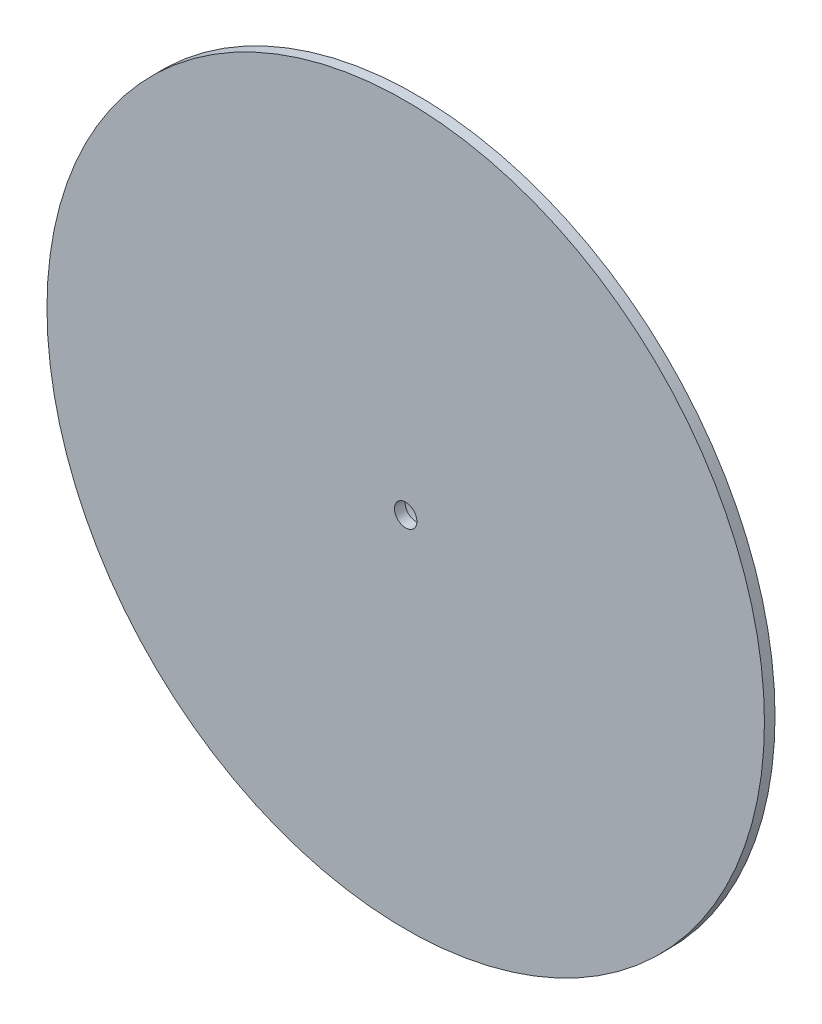
ISO-10303-21;
HEADER;
FILE_DESCRIPTION(('STEP AP214'),'2;1');
FILE_NAME('part.step','',(''),(''),'','','');
FILE_SCHEMA(('AUTOMOTIVE_DESIGN { 1 0 10303 214 1 1 1 1 }'));
ENDSEC;
DATA;
#1=APPLICATION_CONTEXT('core data for automotive mechanical design processes');
#2=APPLICATION_PROTOCOL_DEFINITION('international standard','automotive_design',2000,#1);
#3=PRODUCT_CONTEXT('',#1,'mechanical');
#4=PRODUCT('Part','Part','',(#3));
#5=PRODUCT_RELATED_PRODUCT_CATEGORY('part','',(#4));
#6=PRODUCT_DEFINITION_FORMATION('','',#4);
#7=PRODUCT_DEFINITION_CONTEXT('part definition',#1,'design');
#8=PRODUCT_DEFINITION('design','',#6,#7);
#9=PRODUCT_DEFINITION_SHAPE('','',#8);
#10=(LENGTH_UNIT() NAMED_UNIT(*) SI_UNIT(.MILLI.,.METRE.));
#11=(NAMED_UNIT(*) PLANE_ANGLE_UNIT() SI_UNIT($,.RADIAN.));
#12=(NAMED_UNIT(*) SI_UNIT($,.STERADIAN.) SOLID_ANGLE_UNIT());
#13=UNCERTAINTY_MEASURE_WITH_UNIT(LENGTH_MEASURE(1.E-05),#10,'distance_accuracy_value','');
#14=(GEOMETRIC_REPRESENTATION_CONTEXT(3) GLOBAL_UNCERTAINTY_ASSIGNED_CONTEXT((#13)) GLOBAL_UNIT_ASSIGNED_CONTEXT((#10,
#11,#12)) REPRESENTATION_CONTEXT('',''));
#15=CARTESIAN_POINT('',(0.,0.,0.));
#16=DIRECTION('',(0.,0.,1.));
#17=DIRECTION('',(1.,0.,0.));
#18=AXIS2_PLACEMENT_3D('',#15,#16,#17);
#19=CARTESIAN_POINT('',(0.,0.,0.));
#20=DIRECTION('',(0.,0.,1.));
#21=DIRECTION('',(1.,0.,0.));
#22=AXIS2_PLACEMENT_3D('',#19,#20,#21);
#23=PLANE('',#22);
#24=CARTESIAN_POINT('',(0.,0.,0.));
#25=DIRECTION('',(0.,0.,1.));
#26=DIRECTION('',(1.,0.,0.));
#27=AXIS2_PLACEMENT_3D('',#24,#25,#26);
#28=CIRCLE('',#27,9.525);
#29=CARTESIAN_POINT('',(9.525,0.,0.));
#30=VERTEX_POINT('',#29);
#31=EDGE_CURVE('E48',#30,#30,#28,.T.);
#32=ORIENTED_EDGE('',*,*,#31,.F.);
#33=EDGE_LOOP('',(#32));
#34=FACE_BOUND('',#33,.T.);
#35=CARTESIAN_POINT('',(0.,0.,0.));
#36=DIRECTION('',(0.,0.,1.));
#37=DIRECTION('',(1.,0.,0.));
#38=AXIS2_PLACEMENT_3D('',#35,#36,#37);
#39=CIRCLE('',#38,2.599995);
#40=CARTESIAN_POINT('',(2.599995,0.,0.));
#41=VERTEX_POINT('',#40);
#42=EDGE_CURVE('E55',#41,#41,#39,.T.);
#43=ORIENTED_EDGE('',*,*,#42,.T.);
#44=EDGE_LOOP('',(#43));
#45=FACE_BOUND('',#44,.T.);
#46=ADVANCED_FACE('F44',(#34,#45),#23,.F.);
#47=CARTESIAN_POINT('',(0.,0.,5.));
#48=DIRECTION('',(0.,0.,-1.));
#49=DIRECTION('',(-1.,0.,0.));
#50=AXIS2_PLACEMENT_3D('',#47,#48,#49);
#51=CYLINDRICAL_SURFACE('',#50,9.525);
#52=CARTESIAN_POINT('',(0.,9.525,3.9));
#53=CARTESIAN_POINT('',(0.0781866987109185,9.52499876460585,3.89999676177362));
#54=CARTESIAN_POINT('',(0.156419221102357,9.52402719829567,3.89342807738343));
#55=CARTESIAN_POINT('',(0.310698821870453,9.52024492655388,3.86733282346226));
#56=CARTESIAN_POINT('',(0.386743675519527,9.51743241352691,3.84779351802418));
#57=CARTESIAN_POINT('',(0.5343927745838,9.51028441327874,3.79635240201702));
#58=CARTESIAN_POINT('',(0.606000282843496,9.50595006110438,3.76445980319044));
#59=CARTESIAN_POINT('',(0.742835911522383,9.49623773185762,3.68923963245356));
#60=CARTESIAN_POINT('',(0.808064942988792,9.49085990415479,3.64591369686282));
#61=CARTESIAN_POINT('',(0.930793353147971,9.47961378730952,3.54870975497454));
#62=CARTESIAN_POINT('',(0.988237870136282,9.47374244644208,3.49476282680308));
#63=CARTESIAN_POINT('',(1.09329338010702,9.46219501807809,3.37799654223162));
#64=CARTESIAN_POINT('',(1.1409038163322,9.4565189416516,3.31517668382882));
#65=CARTESIAN_POINT('',(1.22515211249958,9.44597505901761,3.18208063312827));
#66=CARTESIAN_POINT('',(1.26173709992712,9.44111119590441,3.11177063367982));
#67=CARTESIAN_POINT('',(1.32255813135312,9.43278395494999,2.96592048981992));
#68=CARTESIAN_POINT('',(1.34679482137331,9.42932050384585,2.8903806192528));
#69=CARTESIAN_POINT('',(1.38206133446873,9.42421614183361,2.73679113159458));
#70=CARTESIAN_POINT('',(1.39318493095542,9.42256229639832,2.6587634839914));
#71=CARTESIAN_POINT('',(1.40219995736058,9.4212250973639,2.50193289507959));
#72=CARTESIAN_POINT('',(1.4000921171939,9.42154163506819,2.42312999677727));
#73=CARTESIAN_POINT('',(1.38278078144997,9.42409760788303,2.26764709109889));
#74=CARTESIAN_POINT('',(1.36768157603395,9.42632172912797,2.19095518420142));
#75=CARTESIAN_POINT('',(1.32497930663464,9.43241835022669,2.04120539835853));
#76=CARTESIAN_POINT('',(1.29737590185164,9.4362908950078,1.96814761852081));
#77=CARTESIAN_POINT('',(1.23033985517003,9.44526500020631,1.82742175227237));
#78=CARTESIAN_POINT('',(1.19086289034364,9.45037115126149,1.75977508422353));
#79=CARTESIAN_POINT('',(1.10123191313812,9.46123378897109,1.63202672775549));
#80=CARTESIAN_POINT('',(1.05107722752643,9.46699031662115,1.57192551545888));
#81=CARTESIAN_POINT('',(0.940941333333054,9.47857281026604,1.46036957660623));
#82=CARTESIAN_POINT('',(0.880870429310496,9.48439891242584,1.40900337652877));
#83=CARTESIAN_POINT('',(0.752913400811492,9.49541274097992,1.31706821729109));
#84=CARTESIAN_POINT('',(0.685027244533534,9.50060046477638,1.27649930206897));
#85=CARTESIAN_POINT('',(0.543291118251659,9.50975813243168,1.20730634912502));
#86=CARTESIAN_POINT('',(0.469437849058395,9.5137273967087,1.17868897404203));
#87=CARTESIAN_POINT('',(0.31790244986201,9.51999518336653,1.13428753260745));
#88=CARTESIAN_POINT('',(0.240220568647479,9.52229381415501,1.11850263354661));
#89=CARTESIAN_POINT('',(0.0839972754678929,9.5249470181372,1.10033154776508));
#90=CARTESIAN_POINT('',(0.0054703121669874,9.52531925382933,1.09782362381809));
#91=CARTESIAN_POINT('',(-0.150883021297296,9.5241257549903,1.10595479268006));
#92=CARTESIAN_POINT('',(-0.228709412191542,9.5225600779957,1.11659349516616));
#93=CARTESIAN_POINT('',(-0.381084890756114,9.51767760422299,1.15061470286099));
#94=CARTESIAN_POINT('',(-0.455647466798569,9.51436893682704,1.17393806250805));
#95=CARTESIAN_POINT('',(-0.599803759222323,9.50637034194778,1.23260426296617));
#96=CARTESIAN_POINT('',(-0.669397250177601,9.5016803518492,1.26794764865546));
#97=CARTESIAN_POINT('',(-0.802176271103691,9.4913965887219,1.3499373942551));
#98=CARTESIAN_POINT('',(-0.86531351301188,9.48579671649569,1.39666117574029));
#99=CARTESIAN_POINT('',(-0.98289389986906,9.4743359139053,1.49997738146307));
#100=CARTESIAN_POINT('',(-1.03733656038535,9.46847496901829,1.55657035521147));
#101=CARTESIAN_POINT('',(-1.13642388970039,9.45709677324681,1.67855971056336));
#102=CARTESIAN_POINT('',(-1.18098706775715,9.45158263153967,1.74402261789244));
#103=CARTESIAN_POINT('',(-1.25848446661376,9.44157694115363,1.8815761913987));
#104=CARTESIAN_POINT('',(-1.29141899166985,9.43708536572103,1.95366668410714));
#105=CARTESIAN_POINT('',(-1.34459715557604,9.42965571071401,2.1021834613621));
#106=CARTESIAN_POINT('',(-1.36488407478935,9.42671233862251,2.17859397248118));
#107=CARTESIAN_POINT('',(-1.39232913459725,9.4226981384178,2.33378392167989));
#108=CARTESIAN_POINT('',(-1.3994881426399,9.42162718658159,2.41256320288953));
#109=CARTESIAN_POINT('',(-1.40045413711479,9.4214835768477,2.56944241442507));
#110=CARTESIAN_POINT('',(-1.39438923716491,9.42239174512963,2.64754156860861));
#111=CARTESIAN_POINT('',(-1.36935369459666,9.42606243601036,2.80159650274563));
#112=CARTESIAN_POINT('',(-1.35038306942762,9.42882495610196,2.87755228559694));
#113=CARTESIAN_POINT('',(-1.30011922256559,9.43588648105929,3.0251312704112));
#114=CARTESIAN_POINT('',(-1.26883459825297,9.44018441373858,3.09675745504841));
#115=CARTESIAN_POINT('',(-1.19484351444486,9.44983385425447,3.23376505774757));
#116=CARTESIAN_POINT('',(-1.15213669936454,9.45518539488962,3.2991462813113));
#117=CARTESIAN_POINT('',(-1.05604672982191,9.46640084993592,3.42245949837233));
#118=CARTESIAN_POINT('',(-1.00256859691487,9.47226904074502,3.48031710054192));
#119=CARTESIAN_POINT('',(-0.886654665247106,9.48382062623112,3.58628287665215));
#120=CARTESIAN_POINT('',(-0.824216784042599,9.48950397756961,3.63438877779304));
#121=CARTESIAN_POINT('',(-0.691769263074331,9.50007965104623,3.7197111553433));
#122=CARTESIAN_POINT('',(-0.621721426060914,9.5049676431508,3.75686886201752));
#123=CARTESIAN_POINT('',(-0.476341076308347,9.51335927557351,3.81883662605286));
#124=CARTESIAN_POINT('',(-0.401014166138519,9.51686435810957,3.84365955423907));
#125=CARTESIAN_POINT('',(-0.271118598041161,9.52128927002518,3.87458102051206));
#126=CARTESIAN_POINT('',(-0.217354178642811,9.52267369549689,3.88409868504258));
#127=CARTESIAN_POINT('',(-0.109067267356373,9.52452948606479,3.89680926733448));
#128=CARTESIAN_POINT('',(-0.0545447843408702,9.5250008618385,3.90000225905892));
#129=CARTESIAN_POINT('',(0.,9.525,3.9));
#130=B_SPLINE_CURVE_WITH_KNOTS('',3,(#52,#53,#54,#55,#56,#57,#58,#59,#60,#61,#62,#63,#64,#65,
#66,#67,#68,#69,#70,#71,#72,#73,#74,#75,#76,#77,#78,#79,#80,#81,#82,#83,#84,#85,#86,#87,#88,#89,
#90,#91,#92,#93,#94,#95,#96,#97,#98,#99,#100,#101,#102,#103,#104,#105,#106,#107,#108,#109,#110,
#111,#112,#113,#114,#115,#116,#117,#118,#119,#120,#121,#122,#123,#124,#125,#126,#127,#128,#129),
.UNSPECIFIED.,.T.,.F.,(4,2,2,2,2,2,2,2,2,2,2,2,2,2,2,2,2,2,2,2,2,2,2,2,2,2,2,2,2,2,2,2,2,2,2,2,
2,2,4),(0.,0.23436079397018,0.468952048845441,0.703368706811438,0.937751833645347,
1.17370927429062,1.40968007002527,1.64676508734097,1.88383769988556,2.11920448852209,
2.35455829321684,2.58804020196426,2.82152847460209,3.0558993895711,3.29028508605434,
3.52692043769917,3.76355675228518,4.00032480926721,4.23707750096138,4.4716555878611,
4.70622671031335,4.93971334489351,5.17321056503709,5.40834296960503,5.64348847038906,
5.88050681312279,6.11751895396409,6.35371551731004,6.58989647302169,6.82379947514924,
7.05770216102613,7.29144182971485,7.52518877581289,7.76109495914289,7.99705606136531,
8.23426163982863,8.47121918170333,8.63471640910151,8.79821172449169),.UNSPECIFIED.);
#131=CARTESIAN_POINT('',(0.,9.525,3.9));
#132=VERTEX_POINT('',#131);
#133=EDGE_CURVE('E82',#132,#132,#130,.T.);
#134=ORIENTED_EDGE('',*,*,#133,.F.);
#135=EDGE_LOOP('',(#134));
#136=FACE_BOUND('',#135,.T.);
#137=CARTESIAN_POINT('',(0.,0.,5.));
#138=DIRECTION('',(0.,0.,1.));
#139=DIRECTION('',(1.,0.,0.));
#140=AXIS2_PLACEMENT_3D('',#137,#138,#139);
#141=CIRCLE('',#140,9.525);
#142=CARTESIAN_POINT('',(9.525,0.,5.));
#143=VERTEX_POINT('',#142);
#144=EDGE_CURVE('E12',#143,#143,#141,.T.);
#145=ORIENTED_EDGE('',*,*,#144,.F.);
#146=EDGE_LOOP('',(#145));
#147=FACE_BOUND('',#146,.T.);
#148=ORIENTED_EDGE('',*,*,#31,.T.);
#149=EDGE_LOOP('',(#148));
#150=FACE_BOUND('',#149,.T.);
#151=ADVANCED_FACE('F46',(#136,#147,#150),#51,.T.);
#152=CARTESIAN_POINT('',(0.,0.,5.));
#153=DIRECTION('',(0.,0.,-1.));
#154=DIRECTION('',(-1.,0.,0.));
#155=AXIS2_PLACEMENT_3D('',#152,#153,#154);
#156=CYLINDRICAL_SURFACE('',#155,2.599995);
#157=CARTESIAN_POINT('',(0.,2.599995,3.9));
#158=CARTESIAN_POINT('',(0.0729047889705803,2.59999078667712,3.89999529477338));
#159=CARTESIAN_POINT('',(0.14587527045286,2.59689696724784,3.89427217254182));
#160=CARTESIAN_POINT('',(0.289615804895891,2.58482509995093,3.87165399570647));
#161=CARTESIAN_POINT('',(0.360382408027539,2.57583826912691,3.85474226524164));
#162=CARTESIAN_POINT('',(0.497426105322078,2.55291017642826,3.81062161850003));
#163=CARTESIAN_POINT('',(0.563720196645613,2.53898909582972,3.78345461768301));
#164=CARTESIAN_POINT('',(0.690685466240474,2.50743165887607,3.71983650264355));
#165=CARTESIAN_POINT('',(0.751356551193288,2.48979524087771,3.68338523437852));
#166=CARTESIAN_POINT('',(0.869919479682686,2.45099177393897,3.59948275791417));
#167=CARTESIAN_POINT('',(0.927353515966035,2.42966742344935,3.55145860673426));
#168=CARTESIAN_POINT('',(1.03378333749361,2.38633073412561,3.44702638272309));
#169=CARTESIAN_POINT('',(1.08277158088479,2.36431780091444,3.39061089953781));
#170=CARTESIAN_POINT('',(1.17553536152474,2.31969401222259,3.26471327780319));
#171=CARTESIAN_POINT('',(1.21839633112316,2.29721942733858,3.1945027961013));
#172=CARTESIAN_POINT('',(1.29153066405412,2.25691742408613,3.04657193946939));
#173=CARTESIAN_POINT('',(1.32181383507117,2.23908638891825,2.96885747436107));
#174=CARTESIAN_POINT('',(1.3668137386416,2.21188870525528,2.81300588066102));
#175=CARTESIAN_POINT('',(1.38238827445313,2.20206099441669,2.7352014969995));
#176=CARTESIAN_POINT('',(1.40009373665063,2.19085259697842,2.57751867634597));
#177=CARTESIAN_POINT('',(1.40224231485347,2.18946081928337,2.49764310134378));
#178=CARTESIAN_POINT('',(1.39366046336704,2.19492391635172,2.35052192328691));
#179=CARTESIAN_POINT('',(1.38474227331118,2.20061871532846,2.28311578147379));
#180=CARTESIAN_POINT('',(1.35747049355557,2.21754438142815,2.15096095300736));
#181=CARTESIAN_POINT('',(1.33911296233483,2.22877756109407,2.08621338868356));
#182=CARTESIAN_POINT('',(1.29321391516784,2.25572366822494,1.9593979975604));
#183=CARTESIAN_POINT('',(1.26547735546571,2.27153060821631,1.89742170830676));
#184=CARTESIAN_POINT('',(1.20177045608236,2.30586867917457,1.77868696665894));
#185=CARTESIAN_POINT('',(1.16579649143515,2.3244010081923,1.72193082691085));
#186=CARTESIAN_POINT('',(1.08035575439139,2.36545386455347,1.6062735151577));
#187=CARTESIAN_POINT('',(1.02967388817815,2.3881553008729,1.54833084746676));
#188=CARTESIAN_POINT('',(0.919310950549458,2.43277345892092,1.44133134457699));
#189=CARTESIAN_POINT('',(0.859624231196589,2.45468967740074,1.39228012900004));
#190=CARTESIAN_POINT('',(0.728334602433867,2.49690591794703,1.30155229568497));
#191=CARTESIAN_POINT('',(0.656223244123893,2.51702236886815,1.26051872578485));
#192=CARTESIAN_POINT('',(0.504772989726001,2.55170368227059,1.19152370517262));
#193=CARTESIAN_POINT('',(0.425440730020593,2.56627357974497,1.16355039350481));
#194=CARTESIAN_POINT('',(0.26951601467922,2.58707354445778,1.12405333610286));
#195=CARTESIAN_POINT('',(0.193330101985343,2.59394135476105,1.11126538153201));
#196=CARTESIAN_POINT('',(0.039600947338834,2.60082900993271,1.09844016491548));
#197=CARTESIAN_POINT('',(-0.037941457581041,2.60085293848166,1.09839529918739));
#198=CARTESIAN_POINT('',(-0.184491835385638,2.59438215717786,1.11044491815665));
#199=CARTESIAN_POINT('',(-0.253623784879571,2.5884924331094,1.12141276921305));
#200=CARTESIAN_POINT('',(-0.388895646185386,2.5716495011182,1.15330398293682));
#201=CARTESIAN_POINT('',(-0.455035248645629,2.56069577098099,1.17422837235677));
#202=CARTESIAN_POINT('',(-0.584346642608228,2.53435908499139,1.22583158599007));
#203=CARTESIAN_POINT('',(-0.647407745033565,2.51887527211528,1.25673440327369));
#204=CARTESIAN_POINT('',(-0.767626235284159,2.48488080102223,1.32713670145014));
#205=CARTESIAN_POINT('',(-0.82478134945105,2.46636898413068,1.36663947506398));
#206=CARTESIAN_POINT('',(-0.938197899036948,2.42564886584945,1.45805343349366));
#207=CARTESIAN_POINT('',(-0.993682495454874,2.40325759590643,1.51084790729868));
#208=CARTESIAN_POINT('',(-1.09541216870017,2.35863063340585,1.62483358556953));
#209=CARTESIAN_POINT('',(-1.14164835135172,2.33639511026707,1.68603277836679));
#210=CARTESIAN_POINT('',(-1.22674045065121,2.29292893942709,1.82039321629278));
#211=CARTESIAN_POINT('',(-1.26484690031855,2.27187945881046,1.89409345548427));
#212=CARTESIAN_POINT('',(-1.32773467802452,2.23571598798997,2.04830509719545));
#213=CARTESIAN_POINT('',(-1.35253515734026,2.22059347560402,2.12880651642942));
#214=CARTESIAN_POINT('',(-1.38564605999059,2.20006963396152,2.28601628782494));
#215=CARTESIAN_POINT('',(-1.39533193719358,2.19386225284627,2.36232568138352));
#216=CARTESIAN_POINT('',(-1.40201021822551,2.1896035968583,2.51570349616486));
#217=CARTESIAN_POINT('',(-1.39901191009286,2.19154635401005,2.59277132078069));
#218=CARTESIAN_POINT('',(-1.3817364801259,2.20246553879257,2.73514235772261));
#219=CARTESIAN_POINT('',(-1.36892735972027,2.21052533723509,2.80070484672634));
#220=CARTESIAN_POINT('',(-1.33441932407695,2.23152516962156,2.92862135514861));
#221=CARTESIAN_POINT('',(-1.31271701440404,2.24446706686042,2.99097413921683));
#222=CARTESIAN_POINT('',(-1.25954151629174,2.27475686905852,3.11514691756123));
#223=CARTESIAN_POINT('',(-1.22753477284832,2.29233261204308,3.17668091801614));
#224=CARTESIAN_POINT('',(-1.15518197535647,2.32963200245548,3.29391790667453));
#225=CARTESIAN_POINT('',(-1.11483144005171,2.34935680138681,3.34961773716269));
#226=CARTESIAN_POINT('',(-1.01995378816553,2.39222927909134,3.46223077027146));
#227=CARTESIAN_POINT('',(-0.964211559727043,2.41545060073883,3.51809787640122));
#228=CARTESIAN_POINT('',(-0.8436806016577,2.46014392183939,3.62001482690573));
#229=CARTESIAN_POINT('',(-0.778885876534062,2.48161474688683,3.6660581134431));
#230=CARTESIAN_POINT('',(-0.639631828153539,2.52115520532575,3.7480280833208));
#231=CARTESIAN_POINT('',(-0.564956732052365,2.53911581974805,3.78364381366238));
#232=CARTESIAN_POINT('',(-0.409484715282539,2.56875654362687,3.84132552805587));
#233=CARTESIAN_POINT('',(-0.328704593443944,2.58045321924647,3.86342727456899));
#234=CARTESIAN_POINT('',(-0.205815447407648,2.59215891621267,3.88540417387295));
#235=CARTESIAN_POINT('',(-0.164907232978195,2.59508677825692,3.89086677492032));
#236=CARTESIAN_POINT('',(-0.0826730571552807,2.59900602030977,3.898166032335));
#237=CARTESIAN_POINT('',(-0.0413470934371935,2.59999738953651,3.90000266851393));
#238=CARTESIAN_POINT('',(0.,2.599995,3.9));
#239=B_SPLINE_CURVE_WITH_KNOTS('',3,(#157,#158,#159,#160,#161,#162,#163,#164,#165,#166,#167,
#168,#169,#170,#171,#172,#173,#174,#175,#176,#177,#178,#179,#180,#181,#182,#183,#184,#185,#186,
#187,#188,#189,#190,#191,#192,#193,#194,#195,#196,#197,#198,#199,#200,#201,#202,#203,#204,#205,
#206,#207,#208,#209,#210,#211,#212,#213,#214,#215,#216,#217,#218,#219,#220,#221,#222,#223,#224,
#225,#226,#227,#228,#229,#230,#231,#232,#233,#234,#235,#236,#237,#238),.UNSPECIFIED.,.T.,.F.,(4,
2,2,2,2,2,2,2,2,2,2,2,2,2,2,2,2,2,2,2,2,2,2,2,2,2,2,2,2,2,2,2,2,2,2,2,2,2,2,2,4),(0.,
0.2185476571075,0.437421780690726,0.655410838844262,0.873403514061681,1.10598661746122,
1.33877634716544,1.59331429358873,1.84765338676718,2.08602727311499,2.32408769064606,
2.5278243893032,2.73164623006571,2.9399979481385,3.14844153062048,3.38819707826267,
3.62810363309425,3.88283568684122,4.1373359479986,4.36870031122877,4.59992662120846,
4.80968582229974,5.01946665917302,5.23432874988971,5.44927325138268,5.68765262805976,
5.92626016287942,6.18167841769109,6.43672805614954,6.66683517643809,6.8967738291717,
7.09775416437781,7.29881128318751,7.51265311355904,7.72661009309464,7.97231141642947,
8.21817624670887,8.47076202573566,8.72267645332503,8.84662249603624,8.97056922884347),.UNSPECIFIED.);
#240=CARTESIAN_POINT('',(0.,2.599995,3.9));
#241=VERTEX_POINT('',#240);
#242=EDGE_CURVE('E74',#241,#241,#239,.T.);
#243=ORIENTED_EDGE('',*,*,#242,.T.);
#244=EDGE_LOOP('',(#243));
#245=FACE_BOUND('',#244,.T.);
#246=CARTESIAN_POINT('',(0.,0.,5.));
#247=DIRECTION('',(0.,0.,1.));
#248=DIRECTION('',(1.,0.,0.));
#249=AXIS2_PLACEMENT_3D('',#246,#247,#248);
#250=CIRCLE('',#249,2.599995);
#251=CARTESIAN_POINT('',(2.599995,0.,5.));
#252=VERTEX_POINT('',#251);
#253=EDGE_CURVE('E59',#252,#252,#250,.T.);
#254=ORIENTED_EDGE('',*,*,#253,.T.);
#255=EDGE_LOOP('',(#254));
#256=FACE_BOUND('',#255,.T.);
#257=ORIENTED_EDGE('',*,*,#42,.F.);
#258=EDGE_LOOP('',(#257));
#259=FACE_BOUND('',#258,.T.);
#260=ADVANCED_FACE('F111',(#245,#256,#259),#156,.F.);
#261=CARTESIAN_POINT('',(0.,0.,5.));
#262=DIRECTION('',(0.,0.,1.));
#263=DIRECTION('',(1.,0.,0.));
#264=AXIS2_PLACEMENT_3D('',#261,#262,#263);
#265=PLANE('',#264);
#266=CARTESIAN_POINT('',(0.,0.,5.));
#267=DIRECTION('',(0.,0.,1.));
#268=DIRECTION('',(1.,0.,0.));
#269=AXIS2_PLACEMENT_3D('',#266,#267,#268);
#270=CIRCLE('',#269,0.79375);
#271=CARTESIAN_POINT('',(0.79375,0.,5.));
#272=VERTEX_POINT('',#271);
#273=EDGE_CURVE('E66',#272,#272,#270,.T.);
#274=ORIENTED_EDGE('',*,*,#273,.T.);
#275=EDGE_LOOP('',(#274));
#276=FACE_BOUND('',#275,.T.);
#277=ORIENTED_EDGE('',*,*,#253,.F.);
#278=EDGE_LOOP('',(#277));
#279=FACE_BOUND('',#278,.T.);
#280=ADVANCED_FACE('F107',(#276,#279),#265,.F.);
#281=CARTESIAN_POINT('',(0.,0.,5.75));
#282=DIRECTION('',(0.,0.,-1.));
#283=DIRECTION('',(-1.,0.,0.));
#284=AXIS2_PLACEMENT_3D('',#281,#282,#283);
#285=CYLINDRICAL_SURFACE('',#284,25.4);
#286=CARTESIAN_POINT('',(0.,0.,5.75));
#287=DIRECTION('',(0.,0.,1.));
#288=DIRECTION('',(1.,0.,0.));
#289=AXIS2_PLACEMENT_3D('',#286,#287,#288);
#290=CIRCLE('',#289,25.4);
#291=CARTESIAN_POINT('',(25.4,0.,5.75));
#292=VERTEX_POINT('',#291);
#293=EDGE_CURVE('E62',#292,#292,#290,.T.);
#294=ORIENTED_EDGE('',*,*,#293,.F.);
#295=EDGE_LOOP('',(#294));
#296=FACE_BOUND('',#295,.T.);
#297=CARTESIAN_POINT('',(0.,0.,5.));
#298=DIRECTION('',(0.,0.,1.));
#299=DIRECTION('',(1.,0.,0.));
#300=AXIS2_PLACEMENT_3D('',#297,#298,#299);
#301=CIRCLE('',#300,25.4);
#302=CARTESIAN_POINT('',(25.4,0.,5.));
#303=VERTEX_POINT('',#302);
#304=EDGE_CURVE('E63',#303,#303,#301,.T.);
#305=ORIENTED_EDGE('',*,*,#304,.T.);
#306=EDGE_LOOP('',(#305));
#307=FACE_BOUND('',#306,.T.);
#308=ADVANCED_FACE('F103',(#296,#307),#285,.T.);
#309=CARTESIAN_POINT('',(0.,0.,5.75));
#310=DIRECTION('',(0.,0.,1.));
#311=DIRECTION('',(1.,0.,0.));
#312=AXIS2_PLACEMENT_3D('',#309,#310,#311);
#313=PLANE('',#312);
#314=CARTESIAN_POINT('',(0.,0.,5.75));
#315=DIRECTION('',(0.,0.,1.));
#316=DIRECTION('',(1.,0.,0.));
#317=AXIS2_PLACEMENT_3D('',#314,#315,#316);
#318=CIRCLE('',#317,0.79375);
#319=CARTESIAN_POINT('',(0.79375,0.,5.75));
#320=VERTEX_POINT('',#319);
#321=EDGE_CURVE('E71',#320,#320,#318,.T.);
#322=ORIENTED_EDGE('',*,*,#321,.F.);
#323=EDGE_LOOP('',(#322));
#324=FACE_BOUND('',#323,.T.);
#325=ORIENTED_EDGE('',*,*,#293,.T.);
#326=EDGE_LOOP('',(#325));
#327=FACE_BOUND('',#326,.T.);
#328=ADVANCED_FACE('F100',(#324,#327),#313,.T.);
#329=ORIENTED_EDGE('',*,*,#144,.T.);
#330=EDGE_LOOP('',(#329));
#331=FACE_BOUND('',#330,.T.);
#332=ORIENTED_EDGE('',*,*,#304,.F.);
#333=EDGE_LOOP('',(#332));
#334=FACE_BOUND('',#333,.T.);
#335=ADVANCED_FACE('F98',(#331,#334),#265,.F.);
#336=CARTESIAN_POINT('',(0.,0.,3.21));
#337=DIRECTION('',(0.,0.,1.));
#338=DIRECTION('',(1.,0.,0.));
#339=AXIS2_PLACEMENT_3D('',#336,#337,#338);
#340=CYLINDRICAL_SURFACE('',#339,0.79375);
#341=ORIENTED_EDGE('',*,*,#321,.T.);
#342=EDGE_LOOP('',(#341));
#343=FACE_BOUND('',#342,.T.);
#344=ORIENTED_EDGE('',*,*,#273,.F.);
#345=EDGE_LOOP('',(#344));
#346=FACE_BOUND('',#345,.T.);
#347=ADVANCED_FACE('F93',(#343,#346),#340,.F.);
#348=CARTESIAN_POINT('',(0.,-25.401,2.5));
#349=DIRECTION('',(0.,1.,0.));
#350=DIRECTION('',(0.,0.,1.));
#351=AXIS2_PLACEMENT_3D('',#348,#349,#350);
#352=CYLINDRICAL_SURFACE('',#351,1.4);
#353=ORIENTED_EDGE('',*,*,#242,.F.);
#354=EDGE_LOOP('',(#353));
#355=FACE_BOUND('',#354,.T.);
#356=ORIENTED_EDGE('',*,*,#133,.T.);
#357=EDGE_LOOP('',(#356));
#358=FACE_BOUND('',#357,.T.);
#359=ADVANCED_FACE('F87',(#355,#358),#352,.F.);
#360=CLOSED_SHELL('',(#46,#151,#260,#280,#308,#328,#335,#347,#359));
#361=MANIFOLD_SOLID_BREP('B2',#360);
#362=ADVANCED_BREP_SHAPE_REPRESENTATION('',(#18,#361),#14);
#363=SHAPE_DEFINITION_REPRESENTATION(#9,#362);
ENDSEC;
END-ISO-10303-21;
